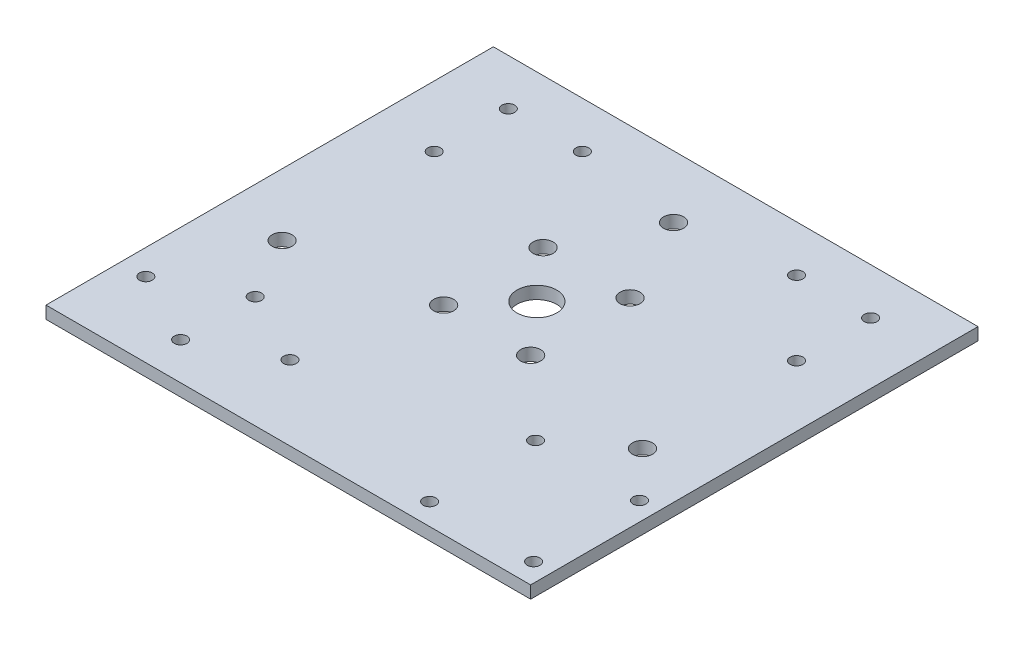
ISO-10303-21;
HEADER;
FILE_DESCRIPTION(('STEP AP214'),'2;1');
FILE_NAME('part.step','',(''),(''),'','','');
FILE_SCHEMA(('AUTOMOTIVE_DESIGN { 1 0 10303 214 1 1 1 1 }'));
ENDSEC;
DATA;
#1=APPLICATION_CONTEXT('core data for automotive mechanical design processes');
#2=APPLICATION_PROTOCOL_DEFINITION('international standard','automotive_design',2000,#1);
#3=PRODUCT_CONTEXT('',#1,'mechanical');
#4=PRODUCT('Part','Part','',(#3));
#5=PRODUCT_RELATED_PRODUCT_CATEGORY('part','',(#4));
#6=PRODUCT_DEFINITION_FORMATION('','',#4);
#7=PRODUCT_DEFINITION_CONTEXT('part definition',#1,'design');
#8=PRODUCT_DEFINITION('design','',#6,#7);
#9=PRODUCT_DEFINITION_SHAPE('','',#8);
#10=(LENGTH_UNIT() NAMED_UNIT(*) SI_UNIT(.MILLI.,.METRE.));
#11=(NAMED_UNIT(*) PLANE_ANGLE_UNIT() SI_UNIT($,.RADIAN.));
#12=(NAMED_UNIT(*) SI_UNIT($,.STERADIAN.) SOLID_ANGLE_UNIT());
#13=UNCERTAINTY_MEASURE_WITH_UNIT(LENGTH_MEASURE(1.E-05),#10,'distance_accuracy_value','');
#14=(GEOMETRIC_REPRESENTATION_CONTEXT(3) GLOBAL_UNCERTAINTY_ASSIGNED_CONTEXT((#13)) GLOBAL_UNIT_ASSIGNED_CONTEXT((#10,
#11,#12)) REPRESENTATION_CONTEXT('',''));
#15=CARTESIAN_POINT('',(0.,0.,0.));
#16=DIRECTION('',(0.,0.,1.));
#17=DIRECTION('',(1.,0.,0.));
#18=AXIS2_PLACEMENT_3D('',#15,#16,#17);
#19=CARTESIAN_POINT('',(0.,3.175,0.));
#20=DIRECTION('',(0.,-1.,0.));
#21=DIRECTION('',(0.,0.,-1.));
#22=AXIS2_PLACEMENT_3D('',#19,#20,#21);
#23=PLANE('',#22);
#24=CARTESIAN_POINT('',(-11.1125,3.175,6.35));
#25=DIRECTION('',(0.,1.,0.));
#26=DIRECTION('',(0.,0.,1.));
#27=AXIS2_PLACEMENT_3D('',#24,#25,#26);
#28=CIRCLE('',#27,2.5527);
#29=CARTESIAN_POINT('',(-11.1125,3.175,8.9027));
#30=VERTEX_POINT('',#29);
#31=EDGE_CURVE('E130',#30,#30,#28,.T.);
#32=ORIENTED_EDGE('',*,*,#31,.F.);
#33=EDGE_LOOP('',(#32));
#34=FACE_BOUND('',#33,.T.);
#35=CARTESIAN_POINT('',(11.1125,3.175,-19.05));
#36=DIRECTION('',(0.,1.,0.));
#37=DIRECTION('',(0.,0.,1.));
#38=AXIS2_PLACEMENT_3D('',#35,#36,#37);
#39=CIRCLE('',#38,2.5527);
#40=CARTESIAN_POINT('',(11.1125,3.175,-16.4973));
#41=VERTEX_POINT('',#40);
#42=EDGE_CURVE('E119',#41,#41,#39,.T.);
#43=ORIENTED_EDGE('',*,*,#42,.F.);
#44=EDGE_LOOP('',(#43));
#45=FACE_BOUND('',#44,.T.);
#46=CARTESIAN_POINT('',(-11.1125,3.175,-19.05));
#47=DIRECTION('',(0.,1.,0.));
#48=DIRECTION('',(0.,0.,1.));
#49=AXIS2_PLACEMENT_3D('',#46,#47,#48);
#50=CIRCLE('',#49,2.5527);
#51=CARTESIAN_POINT('',(-11.1125,3.175,-16.4973));
#52=VERTEX_POINT('',#51);
#53=EDGE_CURVE('E118',#52,#52,#50,.T.);
#54=ORIENTED_EDGE('',*,*,#53,.F.);
#55=EDGE_LOOP('',(#54));
#56=FACE_BOUND('',#55,.T.);
#57=CARTESIAN_POINT('',(11.1125,3.175,6.35));
#58=DIRECTION('',(0.,1.,0.));
#59=DIRECTION('',(0.,0.,1.));
#60=AXIS2_PLACEMENT_3D('',#57,#58,#59);
#61=CIRCLE('',#60,2.5527);
#62=CARTESIAN_POINT('',(11.1125,3.175,8.9027));
#63=VERTEX_POINT('',#62);
#64=EDGE_CURVE('E136',#63,#63,#61,.T.);
#65=ORIENTED_EDGE('',*,*,#64,.F.);
#66=EDGE_LOOP('',(#65));
#67=FACE_BOUND('',#66,.T.);
#68=CARTESIAN_POINT('',(57.15,3.175,24.5745));
#69=DIRECTION('',(0.,1.,0.));
#70=DIRECTION('',(0.,0.,1.));
#71=AXIS2_PLACEMENT_3D('',#68,#69,#70);
#72=CIRCLE('',#71,1.63195);
#73=CARTESIAN_POINT('',(57.15,3.175,26.20645));
#74=VERTEX_POINT('',#73);
#75=EDGE_CURVE('E142',#74,#74,#72,.T.);
#76=ORIENTED_EDGE('',*,*,#75,.F.);
#77=EDGE_LOOP('',(#76));
#78=FACE_BOUND('',#77,.T.);
#79=CARTESIAN_POINT('',(30.5816,3.175,51.6255));
#80=DIRECTION('',(0.,1.,0.));
#81=DIRECTION('',(0.,0.,1.));
#82=AXIS2_PLACEMENT_3D('',#79,#80,#81);
#83=CIRCLE('',#82,1.63195);
#84=CARTESIAN_POINT('',(30.5816,3.175,53.25745));
#85=VERTEX_POINT('',#84);
#86=EDGE_CURVE('E148',#85,#85,#83,.T.);
#87=ORIENTED_EDGE('',*,*,#86,.F.);
#88=EDGE_LOOP('',(#87));
#89=FACE_BOUND('',#88,.T.);
#90=CARTESIAN_POINT('',(30.5816,3.175,24.5745));
#91=DIRECTION('',(0.,1.,0.));
#92=DIRECTION('',(0.,0.,1.));
#93=AXIS2_PLACEMENT_3D('',#90,#91,#92);
#94=CIRCLE('',#93,1.63195);
#95=CARTESIAN_POINT('',(30.5816,3.175,26.20645));
#96=VERTEX_POINT('',#95);
#97=EDGE_CURVE('E115',#96,#96,#94,.T.);
#98=ORIENTED_EDGE('',*,*,#97,.F.);
#99=EDGE_LOOP('',(#98));
#100=FACE_BOUND('',#99,.T.);
#101=CARTESIAN_POINT('',(57.15,3.175,51.6255));
#102=DIRECTION('',(0.,1.,0.));
#103=DIRECTION('',(0.,0.,1.));
#104=AXIS2_PLACEMENT_3D('',#101,#102,#103);
#105=CIRCLE('',#104,1.63195);
#106=CARTESIAN_POINT('',(57.15,3.175,53.25745));
#107=VERTEX_POINT('',#106);
#108=EDGE_CURVE('E114',#107,#107,#105,.T.);
#109=ORIENTED_EDGE('',*,*,#108,.F.);
#110=EDGE_LOOP('',(#109));
#111=FACE_BOUND('',#110,.T.);
#112=CARTESIAN_POINT('',(-55.4609,3.175,38.1));
#113=DIRECTION('',(0.,1.,0.));
#114=DIRECTION('',(0.,0.,1.));
#115=AXIS2_PLACEMENT_3D('',#112,#113,#114);
#116=CIRCLE('',#115,1.63194999999999);
#117=CARTESIAN_POINT('',(-55.4609,3.175,39.73195));
#118=VERTEX_POINT('',#117);
#119=EDGE_CURVE('E161',#118,#118,#116,.T.);
#120=ORIENTED_EDGE('',*,*,#119,.F.);
#121=EDGE_LOOP('',(#120));
#122=FACE_BOUND('',#121,.T.);
#123=CARTESIAN_POINT('',(-37.0459,3.175,28.575));
#124=DIRECTION('',(0.,1.,0.));
#125=DIRECTION('',(0.,0.,1.));
#126=AXIS2_PLACEMENT_3D('',#123,#124,#125);
#127=CIRCLE('',#126,1.63194999999999);
#128=CARTESIAN_POINT('',(-37.0459,3.175,30.20695));
#129=VERTEX_POINT('',#128);
#130=EDGE_CURVE('E167',#129,#129,#127,.T.);
#131=ORIENTED_EDGE('',*,*,#130,.F.);
#132=EDGE_LOOP('',(#131));
#133=FACE_BOUND('',#132,.T.);
#134=CARTESIAN_POINT('',(-18.6309,3.175,38.1));
#135=DIRECTION('',(0.,1.,0.));
#136=DIRECTION('',(0.,0.,1.));
#137=AXIS2_PLACEMENT_3D('',#134,#135,#136);
#138=CIRCLE('',#137,1.63194999999999);
#139=CARTESIAN_POINT('',(-18.6309,3.175,39.73195));
#140=VERTEX_POINT('',#139);
#141=EDGE_CURVE('E173',#140,#140,#138,.T.);
#142=ORIENTED_EDGE('',*,*,#141,.F.);
#143=EDGE_LOOP('',(#142));
#144=FACE_BOUND('',#143,.T.);
#145=CARTESIAN_POINT('',(-37.0459,3.175,47.625));
#146=DIRECTION('',(0.,1.,0.));
#147=DIRECTION('',(0.,0.,1.));
#148=AXIS2_PLACEMENT_3D('',#145,#146,#147);
#149=CIRCLE('',#148,1.63194999999999);
#150=CARTESIAN_POINT('',(-37.0459,3.175,49.25695));
#151=VERTEX_POINT('',#150);
#152=EDGE_CURVE('E179',#151,#151,#149,.T.);
#153=ORIENTED_EDGE('',*,*,#152,.F.);
#154=EDGE_LOOP('',(#153));
#155=FACE_BOUND('',#154,.T.);
#156=CARTESIAN_POINT('',(0.,3.175,-6.35));
#157=DIRECTION('',(0.,1.,0.));
#158=DIRECTION('',(0.,0.,1.));
#159=AXIS2_PLACEMENT_3D('',#156,#157,#158);
#160=CIRCLE('',#159,5.08);
#161=CARTESIAN_POINT('',(0.,3.175,-1.27));
#162=VERTEX_POINT('',#161);
#163=EDGE_CURVE('E185',#162,#162,#160,.T.);
#164=ORIENTED_EDGE('',*,*,#163,.F.);
#165=EDGE_LOOP('',(#164));
#166=FACE_BOUND('',#165,.T.);
#167=DIRECTION('',(0.,0.,-1.));
#168=VECTOR('',#167,1.);
#169=CARTESIAN_POINT('',(-61.9125,3.175,57.15));
#170=LINE('',#169,#168);
#171=CARTESIAN_POINT('',(-61.9125,3.175,57.15));
#172=VERTEX_POINT('',#171);
#173=CARTESIAN_POINT('',(-61.9125,3.175,-57.15));
#174=VERTEX_POINT('',#173);
#175=EDGE_CURVE('E96',#172,#174,#170,.T.);
#176=ORIENTED_EDGE('',*,*,#175,.F.);
#177=DIRECTION('',(1.,0.,0.));
#178=VECTOR('',#177,1.);
#179=CARTESIAN_POINT('',(-61.9125,3.175,57.15));
#180=LINE('',#179,#178);
#181=CARTESIAN_POINT('',(61.9125,3.175,57.15));
#182=VERTEX_POINT('',#181);
#183=EDGE_CURVE('E85',#172,#182,#180,.T.);
#184=ORIENTED_EDGE('',*,*,#183,.T.);
#185=DIRECTION('',(0.,0.,-1.));
#186=VECTOR('',#185,1.);
#187=CARTESIAN_POINT('',(61.9125,3.175,57.15));
#188=LINE('',#187,#186);
#189=CARTESIAN_POINT('',(61.9125,3.175,-57.15));
#190=VERTEX_POINT('',#189);
#191=EDGE_CURVE('E80',#182,#190,#188,.T.);
#192=ORIENTED_EDGE('',*,*,#191,.T.);
#193=DIRECTION('',(1.,0.,0.));
#194=VECTOR('',#193,1.);
#195=CARTESIAN_POINT('',(-61.9125,3.175,-57.15));
#196=LINE('',#195,#194);
#197=EDGE_CURVE('E84',#174,#190,#196,.T.);
#198=ORIENTED_EDGE('',*,*,#197,.F.);
#199=EDGE_LOOP('',(#176,#184,#192,#198));
#200=FACE_BOUND('',#199,.T.);
#201=CARTESIAN_POINT('',(27.3685,3.175,-45.339));
#202=DIRECTION('',(0.,1.,0.));
#203=DIRECTION('',(0.,0.,1.));
#204=AXIS2_PLACEMENT_3D('',#201,#202,#203);
#205=CIRCLE('',#204,1.63194999999999);
#206=CARTESIAN_POINT('',(27.3685,3.175,-43.70705));
#207=VERTEX_POINT('',#206);
#208=EDGE_CURVE('E514',#207,#207,#205,.T.);
#209=ORIENTED_EDGE('',*,*,#208,.F.);
#210=EDGE_LOOP('',(#209));
#211=FACE_BOUND('',#210,.T.);
#212=CARTESIAN_POINT('',(46.2915,3.175,-26.416));
#213=DIRECTION('',(0.,1.,0.));
#214=DIRECTION('',(0.,0.,1.));
#215=AXIS2_PLACEMENT_3D('',#212,#213,#214);
#216=CIRCLE('',#215,1.63194999999999);
#217=CARTESIAN_POINT('',(46.2915,3.175,-24.78405));
#218=VERTEX_POINT('',#217);
#219=EDGE_CURVE('E508',#218,#218,#216,.T.);
#220=ORIENTED_EDGE('',*,*,#219,.F.);
#221=EDGE_LOOP('',(#220));
#222=FACE_BOUND('',#221,.T.);
#223=CARTESIAN_POINT('',(46.2915,3.175,-45.339));
#224=DIRECTION('',(0.,1.,0.));
#225=DIRECTION('',(0.,0.,1.));
#226=AXIS2_PLACEMENT_3D('',#223,#224,#225);
#227=CIRCLE('',#226,1.63194999999999);
#228=CARTESIAN_POINT('',(46.2915,3.175,-43.70705));
#229=VERTEX_POINT('',#228);
#230=EDGE_CURVE('E502',#229,#229,#227,.T.);
#231=ORIENTED_EDGE('',*,*,#230,.F.);
#232=EDGE_LOOP('',(#231));
#233=FACE_BOUND('',#232,.T.);
#234=CARTESIAN_POINT('',(-27.3685,3.175,-45.339));
#235=DIRECTION('',(0.,1.,0.));
#236=DIRECTION('',(0.,0.,1.));
#237=AXIS2_PLACEMENT_3D('',#234,#235,#236);
#238=CIRCLE('',#237,1.63194999999999);
#239=CARTESIAN_POINT('',(-27.3685,3.175,-43.70705));
#240=VERTEX_POINT('',#239);
#241=EDGE_CURVE('E496',#240,#240,#238,.T.);
#242=ORIENTED_EDGE('',*,*,#241,.F.);
#243=EDGE_LOOP('',(#242));
#244=FACE_BOUND('',#243,.T.);
#245=CARTESIAN_POINT('',(-46.2915,3.175,-26.416));
#246=DIRECTION('',(0.,1.,0.));
#247=DIRECTION('',(0.,0.,1.));
#248=AXIS2_PLACEMENT_3D('',#245,#246,#247);
#249=CIRCLE('',#248,1.63194999999999);
#250=CARTESIAN_POINT('',(-46.2915,3.175,-24.78405));
#251=VERTEX_POINT('',#250);
#252=EDGE_CURVE('E490',#251,#251,#249,.T.);
#253=ORIENTED_EDGE('',*,*,#252,.F.);
#254=EDGE_LOOP('',(#253));
#255=FACE_BOUND('',#254,.T.);
#256=CARTESIAN_POINT('',(-46.2915,3.175,-45.339));
#257=DIRECTION('',(0.,1.,0.));
#258=DIRECTION('',(0.,0.,1.));
#259=AXIS2_PLACEMENT_3D('',#256,#257,#258);
#260=CIRCLE('',#259,1.63194999999999);
#261=CARTESIAN_POINT('',(-46.2915,3.175,-43.70705));
#262=VERTEX_POINT('',#261);
#263=EDGE_CURVE('E484',#262,#262,#260,.T.);
#264=ORIENTED_EDGE('',*,*,#263,.F.);
#265=EDGE_LOOP('',(#264));
#266=FACE_BOUND('',#265,.T.);
#267=CARTESIAN_POINT('',(0.,3.175,-41.275));
#268=DIRECTION('',(0.,1.,0.));
#269=DIRECTION('',(0.,0.,1.));
#270=AXIS2_PLACEMENT_3D('',#267,#268,#269);
#271=CIRCLE('',#270,2.5527);
#272=CARTESIAN_POINT('',(0.,3.175,-38.7223));
#273=VERTEX_POINT('',#272);
#274=EDGE_CURVE('E478',#273,#273,#271,.T.);
#275=ORIENTED_EDGE('',*,*,#274,.F.);
#276=EDGE_LOOP('',(#275));
#277=FACE_BOUND('',#276,.T.);
#278=CARTESIAN_POINT('',(46.0375,3.175,12.7));
#279=DIRECTION('',(0.,1.,0.));
#280=DIRECTION('',(0.,0.,1.));
#281=AXIS2_PLACEMENT_3D('',#278,#279,#280);
#282=CIRCLE('',#281,2.5527);
#283=CARTESIAN_POINT('',(46.0375,3.175,15.2527));
#284=VERTEX_POINT('',#283);
#285=EDGE_CURVE('E469',#284,#284,#282,.T.);
#286=ORIENTED_EDGE('',*,*,#285,.F.);
#287=EDGE_LOOP('',(#286));
#288=FACE_BOUND('',#287,.T.);
#289=CARTESIAN_POINT('',(-46.0375,3.175,12.7));
#290=DIRECTION('',(0.,1.,0.));
#291=DIRECTION('',(0.,0.,1.));
#292=AXIS2_PLACEMENT_3D('',#289,#290,#291);
#293=CIRCLE('',#292,2.5527);
#294=CARTESIAN_POINT('',(-46.0375,3.175,15.2527));
#295=VERTEX_POINT('',#294);
#296=EDGE_CURVE('E465',#295,#295,#293,.T.);
#297=ORIENTED_EDGE('',*,*,#296,.F.);
#298=EDGE_LOOP('',(#297));
#299=FACE_BOUND('',#298,.T.);
#300=ADVANCED_FACE('F33',(#34,#45,#56,#67,#78,#89,#100,#111,#122,#133,#144,#155,#166,#200,#211,
#222,#233,#244,#255,#266,#277,#288,#299),#23,.F.);
#301=CARTESIAN_POINT('',(-61.9125,3.175,57.15));
#302=DIRECTION('',(-1.,0.,0.));
#303=DIRECTION('',(0.,0.,1.));
#304=AXIS2_PLACEMENT_3D('',#301,#302,#303);
#305=PLANE('',#304);
#306=DIRECTION('',(0.,0.,-1.));
#307=VECTOR('',#306,1.);
#308=CARTESIAN_POINT('',(-61.9125,0.,57.15));
#309=LINE('',#308,#307);
#310=CARTESIAN_POINT('',(-61.9125,0.,57.15));
#311=VERTEX_POINT('',#310);
#312=CARTESIAN_POINT('',(-61.9125,0.,-57.15));
#313=VERTEX_POINT('',#312);
#314=EDGE_CURVE('E102',#311,#313,#309,.T.);
#315=ORIENTED_EDGE('',*,*,#314,.F.);
#316=DIRECTION('',(0.,-1.,0.));
#317=VECTOR('',#316,1.);
#318=CARTESIAN_POINT('',(-61.9125,3.175,57.15));
#319=LINE('',#318,#317);
#320=EDGE_CURVE('E11',#172,#311,#319,.T.);
#321=ORIENTED_EDGE('',*,*,#320,.F.);
#322=ORIENTED_EDGE('',*,*,#175,.T.);
#323=DIRECTION('',(0.,-1.,0.));
#324=VECTOR('',#323,1.);
#325=CARTESIAN_POINT('',(-61.9125,3.175,-57.15));
#326=LINE('',#325,#324);
#327=EDGE_CURVE('E75',#174,#313,#326,.T.);
#328=ORIENTED_EDGE('',*,*,#327,.T.);
#329=EDGE_LOOP('',(#315,#321,#322,#328));
#330=FACE_BOUND('',#329,.T.);
#331=ADVANCED_FACE('F35',(#330),#305,.T.);
#332=CARTESIAN_POINT('',(-61.9125,3.175,57.15));
#333=DIRECTION('',(0.,0.,-1.));
#334=DIRECTION('',(-1.,0.,0.));
#335=AXIS2_PLACEMENT_3D('',#332,#333,#334);
#336=PLANE('',#335);
#337=DIRECTION('',(1.,0.,0.));
#338=VECTOR('',#337,1.);
#339=CARTESIAN_POINT('',(-61.9125,0.,57.15));
#340=LINE('',#339,#338);
#341=CARTESIAN_POINT('',(61.9125,0.,57.15));
#342=VERTEX_POINT('',#341);
#343=EDGE_CURVE('E67',#311,#342,#340,.T.);
#344=ORIENTED_EDGE('',*,*,#343,.T.);
#345=DIRECTION('',(0.,-1.,0.));
#346=VECTOR('',#345,1.);
#347=CARTESIAN_POINT('',(61.9125,3.175,57.15));
#348=LINE('',#347,#346);
#349=EDGE_CURVE('E43',#182,#342,#348,.T.);
#350=ORIENTED_EDGE('',*,*,#349,.F.);
#351=ORIENTED_EDGE('',*,*,#183,.F.);
#352=ORIENTED_EDGE('',*,*,#320,.T.);
#353=EDGE_LOOP('',(#344,#350,#351,#352));
#354=FACE_BOUND('',#353,.T.);
#355=ADVANCED_FACE('F198',(#354),#336,.F.);
#356=CARTESIAN_POINT('',(61.9125,3.175,57.15));
#357=DIRECTION('',(-1.,0.,0.));
#358=DIRECTION('',(0.,0.,1.));
#359=AXIS2_PLACEMENT_3D('',#356,#357,#358);
#360=PLANE('',#359);
#361=DIRECTION('',(0.,0.,-1.));
#362=VECTOR('',#361,1.);
#363=CARTESIAN_POINT('',(61.9125,0.,57.15));
#364=LINE('',#363,#362);
#365=CARTESIAN_POINT('',(61.9125,0.,-57.15));
#366=VERTEX_POINT('',#365);
#367=EDGE_CURVE('E92',#342,#366,#364,.T.);
#368=ORIENTED_EDGE('',*,*,#367,.T.);
#369=DIRECTION('',(0.,-1.,0.));
#370=VECTOR('',#369,1.);
#371=CARTESIAN_POINT('',(61.9125,3.175,-57.15));
#372=LINE('',#371,#370);
#373=EDGE_CURVE('E89',#190,#366,#372,.T.);
#374=ORIENTED_EDGE('',*,*,#373,.F.);
#375=ORIENTED_EDGE('',*,*,#191,.F.);
#376=ORIENTED_EDGE('',*,*,#349,.T.);
#377=EDGE_LOOP('',(#368,#374,#375,#376));
#378=FACE_BOUND('',#377,.T.);
#379=ADVANCED_FACE('F90',(#378),#360,.F.);
#380=CARTESIAN_POINT('',(-61.9125,3.175,-57.15));
#381=DIRECTION('',(0.,0.,-1.));
#382=DIRECTION('',(-1.,0.,0.));
#383=AXIS2_PLACEMENT_3D('',#380,#381,#382);
#384=PLANE('',#383);
#385=DIRECTION('',(1.,0.,0.));
#386=VECTOR('',#385,1.);
#387=CARTESIAN_POINT('',(-61.9125,0.,-57.15));
#388=LINE('',#387,#386);
#389=EDGE_CURVE('E105',#313,#366,#388,.T.);
#390=ORIENTED_EDGE('',*,*,#389,.F.);
#391=ORIENTED_EDGE('',*,*,#327,.F.);
#392=ORIENTED_EDGE('',*,*,#197,.T.);
#393=ORIENTED_EDGE('',*,*,#373,.T.);
#394=EDGE_LOOP('',(#390,#391,#392,#393));
#395=FACE_BOUND('',#394,.T.);
#396=ADVANCED_FACE('F95',(#395),#384,.T.);
#397=CARTESIAN_POINT('',(0.,0.,0.));
#398=DIRECTION('',(0.,-1.,0.));
#399=DIRECTION('',(0.,0.,-1.));
#400=AXIS2_PLACEMENT_3D('',#397,#398,#399);
#401=PLANE('',#400);
#402=CARTESIAN_POINT('',(-46.0375,0.,12.7));
#403=DIRECTION('',(0.,-1.,0.));
#404=DIRECTION('',(0.,0.,-1.));
#405=AXIS2_PLACEMENT_3D('',#402,#403,#404);
#406=CIRCLE('',#405,2.5527);
#407=CARTESIAN_POINT('',(-46.0375,0.,10.1473));
#408=VERTEX_POINT('',#407);
#409=EDGE_CURVE('E468',#408,#408,#406,.T.);
#410=ORIENTED_EDGE('',*,*,#409,.F.);
#411=EDGE_LOOP('',(#410));
#412=FACE_BOUND('',#411,.T.);
#413=CARTESIAN_POINT('',(46.0375,0.,12.7));
#414=DIRECTION('',(0.,-1.,0.));
#415=DIRECTION('',(0.,0.,-1.));
#416=AXIS2_PLACEMENT_3D('',#413,#414,#415);
#417=CIRCLE('',#416,2.5527);
#418=CARTESIAN_POINT('',(46.0375,0.,10.1473));
#419=VERTEX_POINT('',#418);
#420=EDGE_CURVE('E472',#419,#419,#417,.T.);
#421=ORIENTED_EDGE('',*,*,#420,.F.);
#422=EDGE_LOOP('',(#421));
#423=FACE_BOUND('',#422,.T.);
#424=CARTESIAN_POINT('',(0.,0.,-41.275));
#425=DIRECTION('',(0.,-1.,0.));
#426=DIRECTION('',(0.,0.,-1.));
#427=AXIS2_PLACEMENT_3D('',#424,#425,#426);
#428=CIRCLE('',#427,2.5527);
#429=CARTESIAN_POINT('',(0.,0.,-43.8277));
#430=VERTEX_POINT('',#429);
#431=EDGE_CURVE('E481',#430,#430,#428,.T.);
#432=ORIENTED_EDGE('',*,*,#431,.F.);
#433=EDGE_LOOP('',(#432));
#434=FACE_BOUND('',#433,.T.);
#435=CARTESIAN_POINT('',(-46.2915,0.,-45.339));
#436=DIRECTION('',(0.,-1.,0.));
#437=DIRECTION('',(0.,0.,-1.));
#438=AXIS2_PLACEMENT_3D('',#435,#436,#437);
#439=CIRCLE('',#438,1.63194999999999);
#440=CARTESIAN_POINT('',(-46.2915,0.,-46.97095));
#441=VERTEX_POINT('',#440);
#442=EDGE_CURVE('E487',#441,#441,#439,.T.);
#443=ORIENTED_EDGE('',*,*,#442,.F.);
#444=EDGE_LOOP('',(#443));
#445=FACE_BOUND('',#444,.T.);
#446=CARTESIAN_POINT('',(-46.2915,0.,-26.416));
#447=DIRECTION('',(0.,-1.,0.));
#448=DIRECTION('',(0.,0.,-1.));
#449=AXIS2_PLACEMENT_3D('',#446,#447,#448);
#450=CIRCLE('',#449,1.63194999999999);
#451=CARTESIAN_POINT('',(-46.2915,0.,-28.04795));
#452=VERTEX_POINT('',#451);
#453=EDGE_CURVE('E493',#452,#452,#450,.T.);
#454=ORIENTED_EDGE('',*,*,#453,.F.);
#455=EDGE_LOOP('',(#454));
#456=FACE_BOUND('',#455,.T.);
#457=CARTESIAN_POINT('',(-27.3685,0.,-45.339));
#458=DIRECTION('',(0.,-1.,0.));
#459=DIRECTION('',(0.,0.,-1.));
#460=AXIS2_PLACEMENT_3D('',#457,#458,#459);
#461=CIRCLE('',#460,1.63194999999999);
#462=CARTESIAN_POINT('',(-27.3685,0.,-46.97095));
#463=VERTEX_POINT('',#462);
#464=EDGE_CURVE('E499',#463,#463,#461,.T.);
#465=ORIENTED_EDGE('',*,*,#464,.F.);
#466=EDGE_LOOP('',(#465));
#467=FACE_BOUND('',#466,.T.);
#468=CARTESIAN_POINT('',(46.2915,0.,-45.339));
#469=DIRECTION('',(0.,-1.,0.));
#470=DIRECTION('',(0.,0.,-1.));
#471=AXIS2_PLACEMENT_3D('',#468,#469,#470);
#472=CIRCLE('',#471,1.63194999999999);
#473=CARTESIAN_POINT('',(46.2915,0.,-46.97095));
#474=VERTEX_POINT('',#473);
#475=EDGE_CURVE('E505',#474,#474,#472,.T.);
#476=ORIENTED_EDGE('',*,*,#475,.F.);
#477=EDGE_LOOP('',(#476));
#478=FACE_BOUND('',#477,.T.);
#479=CARTESIAN_POINT('',(46.2915,0.,-26.416));
#480=DIRECTION('',(0.,-1.,0.));
#481=DIRECTION('',(0.,0.,-1.));
#482=AXIS2_PLACEMENT_3D('',#479,#480,#481);
#483=CIRCLE('',#482,1.63194999999999);
#484=CARTESIAN_POINT('',(46.2915,0.,-28.04795));
#485=VERTEX_POINT('',#484);
#486=EDGE_CURVE('E511',#485,#485,#483,.T.);
#487=ORIENTED_EDGE('',*,*,#486,.F.);
#488=EDGE_LOOP('',(#487));
#489=FACE_BOUND('',#488,.T.);
#490=CARTESIAN_POINT('',(27.3685,0.,-45.339));
#491=DIRECTION('',(0.,-1.,0.));
#492=DIRECTION('',(0.,0.,-1.));
#493=AXIS2_PLACEMENT_3D('',#490,#491,#492);
#494=CIRCLE('',#493,1.63194999999999);
#495=CARTESIAN_POINT('',(27.3685,0.,-46.97095));
#496=VERTEX_POINT('',#495);
#497=EDGE_CURVE('E516',#496,#496,#494,.T.);
#498=ORIENTED_EDGE('',*,*,#497,.F.);
#499=EDGE_LOOP('',(#498));
#500=FACE_BOUND('',#499,.T.);
#501=CARTESIAN_POINT('',(-11.1125,0.,6.35));
#502=DIRECTION('',(0.,-1.,0.));
#503=DIRECTION('',(0.,0.,-1.));
#504=AXIS2_PLACEMENT_3D('',#501,#502,#503);
#505=CIRCLE('',#504,2.5527);
#506=CARTESIAN_POINT('',(-11.1125,0.,3.7973));
#507=VERTEX_POINT('',#506);
#508=EDGE_CURVE('E37',#507,#507,#505,.T.);
#509=ORIENTED_EDGE('',*,*,#508,.F.);
#510=EDGE_LOOP('',(#509));
#511=FACE_BOUND('',#510,.T.);
#512=CARTESIAN_POINT('',(11.1125,0.,-19.05));
#513=DIRECTION('',(0.,-1.,0.));
#514=DIRECTION('',(0.,0.,-1.));
#515=AXIS2_PLACEMENT_3D('',#512,#513,#514);
#516=CIRCLE('',#515,2.5527);
#517=CARTESIAN_POINT('',(11.1125,0.,-21.6027));
#518=VERTEX_POINT('',#517);
#519=EDGE_CURVE('E116',#518,#518,#516,.T.);
#520=ORIENTED_EDGE('',*,*,#519,.F.);
#521=EDGE_LOOP('',(#520));
#522=FACE_BOUND('',#521,.T.);
#523=CARTESIAN_POINT('',(-11.1125,0.,-19.05));
#524=DIRECTION('',(0.,-1.,0.));
#525=DIRECTION('',(0.,0.,-1.));
#526=AXIS2_PLACEMENT_3D('',#523,#524,#525);
#527=CIRCLE('',#526,2.5527);
#528=CARTESIAN_POINT('',(-11.1125,0.,-21.6027));
#529=VERTEX_POINT('',#528);
#530=EDGE_CURVE('E123',#529,#529,#527,.T.);
#531=ORIENTED_EDGE('',*,*,#530,.F.);
#532=EDGE_LOOP('',(#531));
#533=FACE_BOUND('',#532,.T.);
#534=CARTESIAN_POINT('',(11.1125,0.,6.35));
#535=DIRECTION('',(0.,-1.,0.));
#536=DIRECTION('',(0.,0.,-1.));
#537=AXIS2_PLACEMENT_3D('',#534,#535,#536);
#538=CIRCLE('',#537,2.5527);
#539=CARTESIAN_POINT('',(11.1125,0.,3.7973));
#540=VERTEX_POINT('',#539);
#541=EDGE_CURVE('E139',#540,#540,#538,.T.);
#542=ORIENTED_EDGE('',*,*,#541,.F.);
#543=EDGE_LOOP('',(#542));
#544=FACE_BOUND('',#543,.T.);
#545=CARTESIAN_POINT('',(57.15,0.,24.5745));
#546=DIRECTION('',(0.,-1.,0.));
#547=DIRECTION('',(0.,0.,-1.));
#548=AXIS2_PLACEMENT_3D('',#545,#546,#547);
#549=CIRCLE('',#548,1.63195);
#550=CARTESIAN_POINT('',(57.15,0.,22.94255));
#551=VERTEX_POINT('',#550);
#552=EDGE_CURVE('E145',#551,#551,#549,.T.);
#553=ORIENTED_EDGE('',*,*,#552,.F.);
#554=EDGE_LOOP('',(#553));
#555=FACE_BOUND('',#554,.T.);
#556=CARTESIAN_POINT('',(30.5816,0.,51.6255));
#557=DIRECTION('',(0.,-1.,0.));
#558=DIRECTION('',(0.,0.,-1.));
#559=AXIS2_PLACEMENT_3D('',#556,#557,#558);
#560=CIRCLE('',#559,1.63195);
#561=CARTESIAN_POINT('',(30.5816,0.,49.99355));
#562=VERTEX_POINT('',#561);
#563=EDGE_CURVE('E151',#562,#562,#560,.T.);
#564=ORIENTED_EDGE('',*,*,#563,.F.);
#565=EDGE_LOOP('',(#564));
#566=FACE_BOUND('',#565,.T.);
#567=CARTESIAN_POINT('',(30.5816,0.,24.5745));
#568=DIRECTION('',(0.,-1.,0.));
#569=DIRECTION('',(0.,0.,-1.));
#570=AXIS2_PLACEMENT_3D('',#567,#568,#569);
#571=CIRCLE('',#570,1.63195);
#572=CARTESIAN_POINT('',(30.5816,0.,22.94255));
#573=VERTEX_POINT('',#572);
#574=EDGE_CURVE('E112',#573,#573,#571,.T.);
#575=ORIENTED_EDGE('',*,*,#574,.F.);
#576=EDGE_LOOP('',(#575));
#577=FACE_BOUND('',#576,.T.);
#578=CARTESIAN_POINT('',(57.15,0.,51.6255));
#579=DIRECTION('',(0.,-1.,0.));
#580=DIRECTION('',(0.,0.,-1.));
#581=AXIS2_PLACEMENT_3D('',#578,#579,#580);
#582=CIRCLE('',#581,1.63195);
#583=CARTESIAN_POINT('',(57.15,0.,49.99355));
#584=VERTEX_POINT('',#583);
#585=EDGE_CURVE('E158',#584,#584,#582,.T.);
#586=ORIENTED_EDGE('',*,*,#585,.F.);
#587=EDGE_LOOP('',(#586));
#588=FACE_BOUND('',#587,.T.);
#589=CARTESIAN_POINT('',(-55.4609,0.,38.1));
#590=DIRECTION('',(0.,-1.,0.));
#591=DIRECTION('',(0.,0.,-1.));
#592=AXIS2_PLACEMENT_3D('',#589,#590,#591);
#593=CIRCLE('',#592,1.63194999999999);
#594=CARTESIAN_POINT('',(-55.4609,0.,36.46805));
#595=VERTEX_POINT('',#594);
#596=EDGE_CURVE('E164',#595,#595,#593,.T.);
#597=ORIENTED_EDGE('',*,*,#596,.F.);
#598=EDGE_LOOP('',(#597));
#599=FACE_BOUND('',#598,.T.);
#600=CARTESIAN_POINT('',(-37.0459,0.,28.575));
#601=DIRECTION('',(0.,-1.,0.));
#602=DIRECTION('',(0.,0.,-1.));
#603=AXIS2_PLACEMENT_3D('',#600,#601,#602);
#604=CIRCLE('',#603,1.63194999999999);
#605=CARTESIAN_POINT('',(-37.0459,0.,26.94305));
#606=VERTEX_POINT('',#605);
#607=EDGE_CURVE('E170',#606,#606,#604,.T.);
#608=ORIENTED_EDGE('',*,*,#607,.F.);
#609=EDGE_LOOP('',(#608));
#610=FACE_BOUND('',#609,.T.);
#611=CARTESIAN_POINT('',(-18.6309,0.,38.1));
#612=DIRECTION('',(0.,-1.,0.));
#613=DIRECTION('',(0.,0.,-1.));
#614=AXIS2_PLACEMENT_3D('',#611,#612,#613);
#615=CIRCLE('',#614,1.63194999999999);
#616=CARTESIAN_POINT('',(-18.6309,0.,36.46805));
#617=VERTEX_POINT('',#616);
#618=EDGE_CURVE('E176',#617,#617,#615,.T.);
#619=ORIENTED_EDGE('',*,*,#618,.F.);
#620=EDGE_LOOP('',(#619));
#621=FACE_BOUND('',#620,.T.);
#622=CARTESIAN_POINT('',(-37.0459,0.,47.625));
#623=DIRECTION('',(0.,-1.,0.));
#624=DIRECTION('',(0.,0.,-1.));
#625=AXIS2_PLACEMENT_3D('',#622,#623,#624);
#626=CIRCLE('',#625,1.63194999999999);
#627=CARTESIAN_POINT('',(-37.0459,0.,45.99305));
#628=VERTEX_POINT('',#627);
#629=EDGE_CURVE('E182',#628,#628,#626,.T.);
#630=ORIENTED_EDGE('',*,*,#629,.F.);
#631=EDGE_LOOP('',(#630));
#632=FACE_BOUND('',#631,.T.);
#633=CARTESIAN_POINT('',(0.,0.,-6.35));
#634=DIRECTION('',(0.,1.,0.));
#635=DIRECTION('',(0.,0.,1.));
#636=AXIS2_PLACEMENT_3D('',#633,#634,#635);
#637=CIRCLE('',#636,5.08);
#638=CARTESIAN_POINT('',(0.,0.,-1.27));
#639=VERTEX_POINT('',#638);
#640=EDGE_CURVE('E106',#639,#639,#637,.T.);
#641=ORIENTED_EDGE('',*,*,#640,.T.);
#642=EDGE_LOOP('',(#641));
#643=FACE_BOUND('',#642,.T.);
#644=ORIENTED_EDGE('',*,*,#314,.T.);
#645=ORIENTED_EDGE('',*,*,#389,.T.);
#646=ORIENTED_EDGE('',*,*,#367,.F.);
#647=ORIENTED_EDGE('',*,*,#343,.F.);
#648=EDGE_LOOP('',(#644,#645,#646,#647));
#649=FACE_BOUND('',#648,.T.);
#650=ADVANCED_FACE('F204',(#412,#423,#434,#445,#456,#467,#478,#489,#500,#511,#522,#533,#544,
#555,#566,#577,#588,#599,#610,#621,#632,#643,#649),#401,.T.);
#651=CARTESIAN_POINT('',(0.,0.,-6.35));
#652=DIRECTION('',(0.,1.,0.));
#653=DIRECTION('',(0.,0.,1.));
#654=AXIS2_PLACEMENT_3D('',#651,#652,#653);
#655=CYLINDRICAL_SURFACE('',#654,5.08);
#656=ORIENTED_EDGE('',*,*,#640,.F.);
#657=EDGE_LOOP('',(#656));
#658=FACE_BOUND('',#657,.T.);
#659=ORIENTED_EDGE('',*,*,#163,.T.);
#660=EDGE_LOOP('',(#659));
#661=FACE_BOUND('',#660,.T.);
#662=ADVANCED_FACE('F190',(#658,#661),#655,.F.);
#663=CARTESIAN_POINT('',(-37.0459,3.175,47.625));
#664=DIRECTION('',(0.,1.,0.));
#665=DIRECTION('',(0.,0.,1.));
#666=AXIS2_PLACEMENT_3D('',#663,#664,#665);
#667=CYLINDRICAL_SURFACE('',#666,1.63194999999999);
#668=ORIENTED_EDGE('',*,*,#152,.T.);
#669=EDGE_LOOP('',(#668));
#670=FACE_BOUND('',#669,.T.);
#671=ORIENTED_EDGE('',*,*,#629,.T.);
#672=EDGE_LOOP('',(#671));
#673=FACE_BOUND('',#672,.T.);
#674=ADVANCED_FACE('F227',(#670,#673),#667,.F.);
#675=CARTESIAN_POINT('',(-18.6309,3.175,38.1));
#676=DIRECTION('',(0.,1.,0.));
#677=DIRECTION('',(0.,0.,1.));
#678=AXIS2_PLACEMENT_3D('',#675,#676,#677);
#679=CYLINDRICAL_SURFACE('',#678,1.63194999999999);
#680=ORIENTED_EDGE('',*,*,#141,.T.);
#681=EDGE_LOOP('',(#680));
#682=FACE_BOUND('',#681,.T.);
#683=ORIENTED_EDGE('',*,*,#618,.T.);
#684=EDGE_LOOP('',(#683));
#685=FACE_BOUND('',#684,.T.);
#686=ADVANCED_FACE('F234',(#682,#685),#679,.F.);
#687=CARTESIAN_POINT('',(-37.0459,3.175,28.575));
#688=DIRECTION('',(0.,1.,0.));
#689=DIRECTION('',(0.,0.,1.));
#690=AXIS2_PLACEMENT_3D('',#687,#688,#689);
#691=CYLINDRICAL_SURFACE('',#690,1.63194999999999);
#692=ORIENTED_EDGE('',*,*,#130,.T.);
#693=EDGE_LOOP('',(#692));
#694=FACE_BOUND('',#693,.T.);
#695=ORIENTED_EDGE('',*,*,#607,.T.);
#696=EDGE_LOOP('',(#695));
#697=FACE_BOUND('',#696,.T.);
#698=ADVANCED_FACE('F241',(#694,#697),#691,.F.);
#699=CARTESIAN_POINT('',(-55.4609,3.175,38.1));
#700=DIRECTION('',(0.,1.,0.));
#701=DIRECTION('',(0.,0.,1.));
#702=AXIS2_PLACEMENT_3D('',#699,#700,#701);
#703=CYLINDRICAL_SURFACE('',#702,1.63194999999999);
#704=ORIENTED_EDGE('',*,*,#119,.T.);
#705=EDGE_LOOP('',(#704));
#706=FACE_BOUND('',#705,.T.);
#707=ORIENTED_EDGE('',*,*,#596,.T.);
#708=EDGE_LOOP('',(#707));
#709=FACE_BOUND('',#708,.T.);
#710=ADVANCED_FACE('F249',(#706,#709),#703,.F.);
#711=CARTESIAN_POINT('',(57.15,3.175,51.6255));
#712=DIRECTION('',(0.,1.,0.));
#713=DIRECTION('',(0.,0.,1.));
#714=AXIS2_PLACEMENT_3D('',#711,#712,#713);
#715=CYLINDRICAL_SURFACE('',#714,1.63195);
#716=ORIENTED_EDGE('',*,*,#585,.T.);
#717=EDGE_LOOP('',(#716));
#718=FACE_BOUND('',#717,.T.);
#719=ORIENTED_EDGE('',*,*,#108,.T.);
#720=EDGE_LOOP('',(#719));
#721=FACE_BOUND('',#720,.T.);
#722=ADVANCED_FACE('F257',(#718,#721),#715,.F.);
#723=CARTESIAN_POINT('',(30.5816,3.175,24.5745));
#724=DIRECTION('',(0.,1.,0.));
#725=DIRECTION('',(0.,0.,1.));
#726=AXIS2_PLACEMENT_3D('',#723,#724,#725);
#727=CYLINDRICAL_SURFACE('',#726,1.63195);
#728=ORIENTED_EDGE('',*,*,#574,.T.);
#729=EDGE_LOOP('',(#728));
#730=FACE_BOUND('',#729,.T.);
#731=ORIENTED_EDGE('',*,*,#97,.T.);
#732=EDGE_LOOP('',(#731));
#733=FACE_BOUND('',#732,.T.);
#734=ADVANCED_FACE('F265',(#730,#733),#727,.F.);
#735=CARTESIAN_POINT('',(30.5816,3.175,51.6255));
#736=DIRECTION('',(0.,1.,0.));
#737=DIRECTION('',(0.,0.,1.));
#738=AXIS2_PLACEMENT_3D('',#735,#736,#737);
#739=CYLINDRICAL_SURFACE('',#738,1.63195);
#740=ORIENTED_EDGE('',*,*,#563,.T.);
#741=EDGE_LOOP('',(#740));
#742=FACE_BOUND('',#741,.T.);
#743=ORIENTED_EDGE('',*,*,#86,.T.);
#744=EDGE_LOOP('',(#743));
#745=FACE_BOUND('',#744,.T.);
#746=ADVANCED_FACE('F273',(#742,#745),#739,.F.);
#747=CARTESIAN_POINT('',(57.15,3.175,24.5745));
#748=DIRECTION('',(0.,1.,0.));
#749=DIRECTION('',(0.,0.,1.));
#750=AXIS2_PLACEMENT_3D('',#747,#748,#749);
#751=CYLINDRICAL_SURFACE('',#750,1.63195);
#752=ORIENTED_EDGE('',*,*,#552,.T.);
#753=EDGE_LOOP('',(#752));
#754=FACE_BOUND('',#753,.T.);
#755=ORIENTED_EDGE('',*,*,#75,.T.);
#756=EDGE_LOOP('',(#755));
#757=FACE_BOUND('',#756,.T.);
#758=ADVANCED_FACE('F281',(#754,#757),#751,.F.);
#759=CARTESIAN_POINT('',(11.1125,3.175,6.35));
#760=DIRECTION('',(0.,1.,0.));
#761=DIRECTION('',(0.,0.,1.));
#762=AXIS2_PLACEMENT_3D('',#759,#760,#761);
#763=CYLINDRICAL_SURFACE('',#762,2.5527);
#764=ORIENTED_EDGE('',*,*,#541,.T.);
#765=EDGE_LOOP('',(#764));
#766=FACE_BOUND('',#765,.T.);
#767=ORIENTED_EDGE('',*,*,#64,.T.);
#768=EDGE_LOOP('',(#767));
#769=FACE_BOUND('',#768,.T.);
#770=ADVANCED_FACE('F289',(#766,#769),#763,.F.);
#771=CARTESIAN_POINT('',(-11.1125,3.175,-19.05));
#772=DIRECTION('',(0.,1.,0.));
#773=DIRECTION('',(0.,0.,1.));
#774=AXIS2_PLACEMENT_3D('',#771,#772,#773);
#775=CYLINDRICAL_SURFACE('',#774,2.5527);
#776=ORIENTED_EDGE('',*,*,#530,.T.);
#777=EDGE_LOOP('',(#776));
#778=FACE_BOUND('',#777,.T.);
#779=ORIENTED_EDGE('',*,*,#53,.T.);
#780=EDGE_LOOP('',(#779));
#781=FACE_BOUND('',#780,.T.);
#782=ADVANCED_FACE('F297',(#778,#781),#775,.F.);
#783=CARTESIAN_POINT('',(11.1125,3.175,-19.05));
#784=DIRECTION('',(0.,1.,0.));
#785=DIRECTION('',(0.,0.,1.));
#786=AXIS2_PLACEMENT_3D('',#783,#784,#785);
#787=CYLINDRICAL_SURFACE('',#786,2.5527);
#788=ORIENTED_EDGE('',*,*,#519,.T.);
#789=EDGE_LOOP('',(#788));
#790=FACE_BOUND('',#789,.T.);
#791=ORIENTED_EDGE('',*,*,#42,.T.);
#792=EDGE_LOOP('',(#791));
#793=FACE_BOUND('',#792,.T.);
#794=ADVANCED_FACE('F305',(#790,#793),#787,.F.);
#795=CARTESIAN_POINT('',(-11.1125,3.175,6.35));
#796=DIRECTION('',(0.,1.,0.));
#797=DIRECTION('',(0.,0.,1.));
#798=AXIS2_PLACEMENT_3D('',#795,#796,#797);
#799=CYLINDRICAL_SURFACE('',#798,2.5527);
#800=ORIENTED_EDGE('',*,*,#508,.T.);
#801=EDGE_LOOP('',(#800));
#802=FACE_BOUND('',#801,.T.);
#803=ORIENTED_EDGE('',*,*,#31,.T.);
#804=EDGE_LOOP('',(#803));
#805=FACE_BOUND('',#804,.T.);
#806=ADVANCED_FACE('F313',(#802,#805),#799,.F.);
#807=CARTESIAN_POINT('',(27.3685,3.175,-45.339));
#808=DIRECTION('',(0.,1.,0.));
#809=DIRECTION('',(0.,0.,1.));
#810=AXIS2_PLACEMENT_3D('',#807,#808,#809);
#811=CYLINDRICAL_SURFACE('',#810,1.63194999999999);
#812=ORIENTED_EDGE('',*,*,#208,.T.);
#813=EDGE_LOOP('',(#812));
#814=FACE_BOUND('',#813,.T.);
#815=ORIENTED_EDGE('',*,*,#497,.T.);
#816=EDGE_LOOP('',(#815));
#817=FACE_BOUND('',#816,.T.);
#818=ADVANCED_FACE('F320',(#814,#817),#811,.F.);
#819=CARTESIAN_POINT('',(46.2915,3.175,-26.416));
#820=DIRECTION('',(0.,1.,0.));
#821=DIRECTION('',(0.,0.,1.));
#822=AXIS2_PLACEMENT_3D('',#819,#820,#821);
#823=CYLINDRICAL_SURFACE('',#822,1.63194999999999);
#824=ORIENTED_EDGE('',*,*,#219,.T.);
#825=EDGE_LOOP('',(#824));
#826=FACE_BOUND('',#825,.T.);
#827=ORIENTED_EDGE('',*,*,#486,.T.);
#828=EDGE_LOOP('',(#827));
#829=FACE_BOUND('',#828,.T.);
#830=ADVANCED_FACE('F328',(#826,#829),#823,.F.);
#831=CARTESIAN_POINT('',(46.2915,3.175,-45.339));
#832=DIRECTION('',(0.,1.,0.));
#833=DIRECTION('',(0.,0.,1.));
#834=AXIS2_PLACEMENT_3D('',#831,#832,#833);
#835=CYLINDRICAL_SURFACE('',#834,1.63194999999999);
#836=ORIENTED_EDGE('',*,*,#230,.T.);
#837=EDGE_LOOP('',(#836));
#838=FACE_BOUND('',#837,.T.);
#839=ORIENTED_EDGE('',*,*,#475,.T.);
#840=EDGE_LOOP('',(#839));
#841=FACE_BOUND('',#840,.T.);
#842=ADVANCED_FACE('F336',(#838,#841),#835,.F.);
#843=CARTESIAN_POINT('',(-27.3685,3.175,-45.339));
#844=DIRECTION('',(0.,1.,0.));
#845=DIRECTION('',(0.,0.,1.));
#846=AXIS2_PLACEMENT_3D('',#843,#844,#845);
#847=CYLINDRICAL_SURFACE('',#846,1.63194999999999);
#848=ORIENTED_EDGE('',*,*,#241,.T.);
#849=EDGE_LOOP('',(#848));
#850=FACE_BOUND('',#849,.T.);
#851=ORIENTED_EDGE('',*,*,#464,.T.);
#852=EDGE_LOOP('',(#851));
#853=FACE_BOUND('',#852,.T.);
#854=ADVANCED_FACE('F344',(#850,#853),#847,.F.);
#855=CARTESIAN_POINT('',(-46.2915,3.175,-26.416));
#856=DIRECTION('',(0.,1.,0.));
#857=DIRECTION('',(0.,0.,1.));
#858=AXIS2_PLACEMENT_3D('',#855,#856,#857);
#859=CYLINDRICAL_SURFACE('',#858,1.63194999999999);
#860=ORIENTED_EDGE('',*,*,#252,.T.);
#861=EDGE_LOOP('',(#860));
#862=FACE_BOUND('',#861,.T.);
#863=ORIENTED_EDGE('',*,*,#453,.T.);
#864=EDGE_LOOP('',(#863));
#865=FACE_BOUND('',#864,.T.);
#866=ADVANCED_FACE('F352',(#862,#865),#859,.F.);
#867=CARTESIAN_POINT('',(-46.2915,3.175,-45.339));
#868=DIRECTION('',(0.,1.,0.));
#869=DIRECTION('',(0.,0.,1.));
#870=AXIS2_PLACEMENT_3D('',#867,#868,#869);
#871=CYLINDRICAL_SURFACE('',#870,1.63194999999999);
#872=ORIENTED_EDGE('',*,*,#263,.T.);
#873=EDGE_LOOP('',(#872));
#874=FACE_BOUND('',#873,.T.);
#875=ORIENTED_EDGE('',*,*,#442,.T.);
#876=EDGE_LOOP('',(#875));
#877=FACE_BOUND('',#876,.T.);
#878=ADVANCED_FACE('F360',(#874,#877),#871,.F.);
#879=CARTESIAN_POINT('',(0.,3.175,-41.275));
#880=DIRECTION('',(0.,1.,0.));
#881=DIRECTION('',(0.,0.,1.));
#882=AXIS2_PLACEMENT_3D('',#879,#880,#881);
#883=CYLINDRICAL_SURFACE('',#882,2.5527);
#884=ORIENTED_EDGE('',*,*,#274,.T.);
#885=EDGE_LOOP('',(#884));
#886=FACE_BOUND('',#885,.T.);
#887=ORIENTED_EDGE('',*,*,#431,.T.);
#888=EDGE_LOOP('',(#887));
#889=FACE_BOUND('',#888,.T.);
#890=ADVANCED_FACE('F368',(#886,#889),#883,.F.);
#891=CARTESIAN_POINT('',(46.0375,3.175,12.7));
#892=DIRECTION('',(0.,1.,0.));
#893=DIRECTION('',(0.,0.,1.));
#894=AXIS2_PLACEMENT_3D('',#891,#892,#893);
#895=CYLINDRICAL_SURFACE('',#894,2.5527);
#896=ORIENTED_EDGE('',*,*,#285,.T.);
#897=EDGE_LOOP('',(#896));
#898=FACE_BOUND('',#897,.T.);
#899=ORIENTED_EDGE('',*,*,#420,.T.);
#900=EDGE_LOOP('',(#899));
#901=FACE_BOUND('',#900,.T.);
#902=ADVANCED_FACE('F375',(#898,#901),#895,.F.);
#903=CARTESIAN_POINT('',(-46.0375,3.175,12.7));
#904=DIRECTION('',(0.,1.,0.));
#905=DIRECTION('',(0.,0.,1.));
#906=AXIS2_PLACEMENT_3D('',#903,#904,#905);
#907=CYLINDRICAL_SURFACE('',#906,2.5527);
#908=ORIENTED_EDGE('',*,*,#296,.T.);
#909=EDGE_LOOP('',(#908));
#910=FACE_BOUND('',#909,.T.);
#911=ORIENTED_EDGE('',*,*,#409,.T.);
#912=EDGE_LOOP('',(#911));
#913=FACE_BOUND('',#912,.T.);
#914=ADVANCED_FACE('F383',(#910,#913),#907,.F.);
#915=CLOSED_SHELL('',(#300,#331,#355,#379,#396,#650,#662,#674,#686,#698,#710,#722,#734,#746,
#758,#770,#782,#794,#806,#818,#830,#842,#854,#866,#878,#890,#902,#914));
#916=MANIFOLD_SOLID_BREP('B2',#915);
#917=ADVANCED_BREP_SHAPE_REPRESENTATION('',(#18,#916),#14);
#918=SHAPE_DEFINITION_REPRESENTATION(#9,#917);
ENDSEC;
END-ISO-10303-21;
